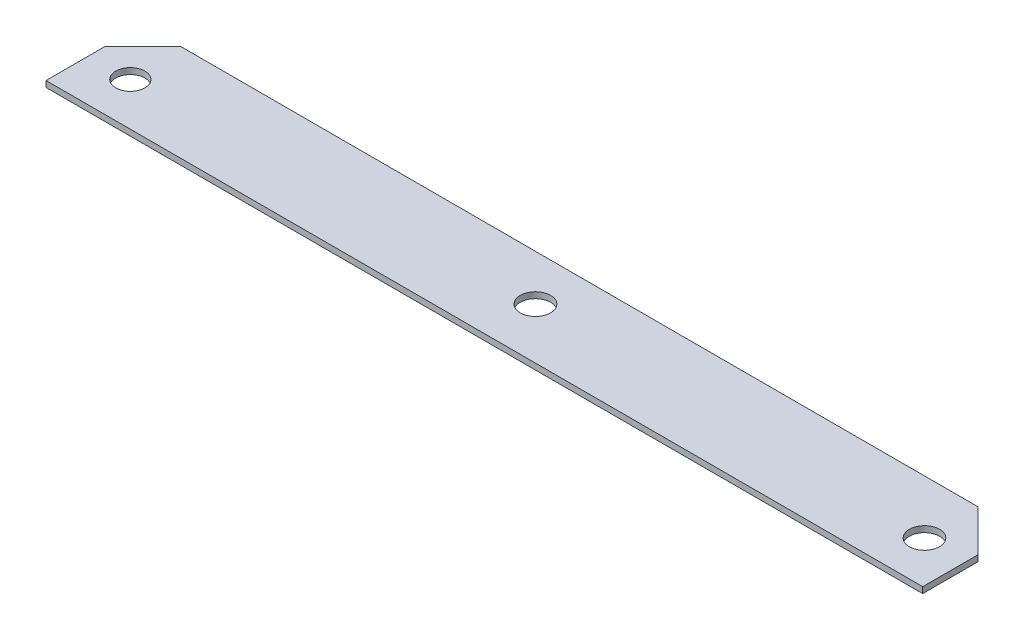
ISO-10303-21;
HEADER;
FILE_DESCRIPTION(('STEP AP214'),'2;1');
FILE_NAME('part.step','',(''),(''),'','','');
FILE_SCHEMA(('AUTOMOTIVE_DESIGN { 1 0 10303 214 1 1 1 1 }'));
ENDSEC;
DATA;
#1=APPLICATION_CONTEXT('core data for automotive mechanical design processes');
#2=APPLICATION_PROTOCOL_DEFINITION('international standard','automotive_design',2000,#1);
#3=PRODUCT_CONTEXT('',#1,'mechanical');
#4=PRODUCT('Part','Part','',(#3));
#5=PRODUCT_RELATED_PRODUCT_CATEGORY('part','',(#4));
#6=PRODUCT_DEFINITION_FORMATION('','',#4);
#7=PRODUCT_DEFINITION_CONTEXT('part definition',#1,'design');
#8=PRODUCT_DEFINITION('design','',#6,#7);
#9=PRODUCT_DEFINITION_SHAPE('','',#8);
#10=(LENGTH_UNIT() NAMED_UNIT(*) SI_UNIT(.MILLI.,.METRE.));
#11=(NAMED_UNIT(*) PLANE_ANGLE_UNIT() SI_UNIT($,.RADIAN.));
#12=(NAMED_UNIT(*) SI_UNIT($,.STERADIAN.) SOLID_ANGLE_UNIT());
#13=UNCERTAINTY_MEASURE_WITH_UNIT(LENGTH_MEASURE(1.E-05),#10,'distance_accuracy_value','');
#14=(GEOMETRIC_REPRESENTATION_CONTEXT(3) GLOBAL_UNCERTAINTY_ASSIGNED_CONTEXT((#13)) GLOBAL_UNIT_ASSIGNED_CONTEXT((#10,
#11,#12)) REPRESENTATION_CONTEXT('',''));
#15=CARTESIAN_POINT('',(0.,0.,0.));
#16=DIRECTION('',(0.,0.,1.));
#17=DIRECTION('',(1.,0.,0.));
#18=AXIS2_PLACEMENT_3D('',#15,#16,#17);
#19=CARTESIAN_POINT('',(122.254977285979,1.5875,-122.254977285981));
#20=DIRECTION('',(0.707106781186539,0.,-0.707106781186556));
#21=DIRECTION('',(-0.707106781186556,0.,-0.707106781186539));
#22=AXIS2_PLACEMENT_3D('',#19,#20,#21);
#23=PLANE('',#22);
#24=DIRECTION('',(0.707106781186556,0.,0.707106781186539));
#25=VECTOR('',#24,1.);
#26=CARTESIAN_POINT('',(122.254977285979,0.,-122.254977285981));
#27=LINE('',#26,#25);
#28=CARTESIAN_POINT('',(219.109954571962,0.,-25.4));
#29=VERTEX_POINT('',#28);
#30=CARTESIAN_POINT('',(230.,0.,-14.5099545719626));
#31=VERTEX_POINT('',#30);
#32=EDGE_CURVE('E130',#29,#31,#27,.T.);
#33=ORIENTED_EDGE('',*,*,#32,.F.);
#34=DIRECTION('',(0.,-1.,0.));
#35=VECTOR('',#34,1.);
#36=CARTESIAN_POINT('',(219.109954571962,1.5875,-25.4));
#37=LINE('',#36,#35);
#38=CARTESIAN_POINT('',(219.109954571962,1.5875,-25.4));
#39=VERTEX_POINT('',#38);
#40=EDGE_CURVE('E11',#39,#29,#37,.T.);
#41=ORIENTED_EDGE('',*,*,#40,.F.);
#42=DIRECTION('',(0.707106781186556,0.,0.707106781186539));
#43=VECTOR('',#42,1.);
#44=CARTESIAN_POINT('',(122.254977285979,1.5875,-122.254977285981));
#45=LINE('',#44,#43);
#46=CARTESIAN_POINT('',(230.,1.5875,-14.5099545719626));
#47=VERTEX_POINT('',#46);
#48=EDGE_CURVE('E194',#39,#47,#45,.T.);
#49=ORIENTED_EDGE('',*,*,#48,.T.);
#50=DIRECTION('',(0.,-1.,0.));
#51=VECTOR('',#50,1.);
#52=CARTESIAN_POINT('',(230.,1.5875,-14.5099545719626));
#53=LINE('',#52,#51);
#54=EDGE_CURVE('E81',#47,#31,#53,.T.);
#55=ORIENTED_EDGE('',*,*,#54,.T.);
#56=EDGE_LOOP('',(#33,#41,#49,#55));
#57=FACE_BOUND('',#56,.T.);
#58=ADVANCED_FACE('F35',(#57),#23,.T.);
#59=CARTESIAN_POINT('',(0.,1.5875,-25.4));
#60=DIRECTION('',(0.,0.,-1.));
#61=DIRECTION('',(-1.,0.,0.));
#62=AXIS2_PLACEMENT_3D('',#59,#60,#61);
#63=PLANE('',#62);
#64=DIRECTION('',(1.,0.,0.));
#65=VECTOR('',#64,1.);
#66=CARTESIAN_POINT('',(0.,0.,-25.4));
#67=LINE('',#66,#65);
#68=CARTESIAN_POINT('',(9.87852439365131,0.,-25.4));
#69=VERTEX_POINT('',#68);
#70=EDGE_CURVE('E132',#69,#29,#67,.T.);
#71=ORIENTED_EDGE('',*,*,#70,.F.);
#72=DIRECTION('',(0.,-1.,0.));
#73=VECTOR('',#72,1.);
#74=CARTESIAN_POINT('',(9.87852439365131,1.5875,-25.4));
#75=LINE('',#74,#73);
#76=CARTESIAN_POINT('',(9.87852439365131,1.5875,-25.4));
#77=VERTEX_POINT('',#76);
#78=EDGE_CURVE('E44',#77,#69,#75,.T.);
#79=ORIENTED_EDGE('',*,*,#78,.F.);
#80=DIRECTION('',(1.,0.,0.));
#81=VECTOR('',#80,1.);
#82=CARTESIAN_POINT('',(0.,1.5875,-25.4));
#83=LINE('',#82,#81);
#84=EDGE_CURVE('E116',#77,#39,#83,.T.);
#85=ORIENTED_EDGE('',*,*,#84,.T.);
#86=ORIENTED_EDGE('',*,*,#40,.T.);
#87=EDGE_LOOP('',(#71,#79,#85,#86));
#88=FACE_BOUND('',#87,.T.);
#89=ADVANCED_FACE('F151',(#88),#63,.T.);
#90=CARTESIAN_POINT('',(-7.76073780317433,1.5875,-7.7607378031743));
#91=DIRECTION('',(-0.707106781186549,0.,-0.707106781186546));
#92=DIRECTION('',(-0.707106781186546,0.,0.707106781186549));
#93=AXIS2_PLACEMENT_3D('',#90,#91,#92);
#94=PLANE('',#93);
#95=DIRECTION('',(0.707106781186546,0.,-0.707106781186549));
#96=VECTOR('',#95,1.);
#97=CARTESIAN_POINT('',(-7.76073780317433,0.,-7.7607378031743));
#98=LINE('',#97,#96);
#99=CARTESIAN_POINT('',(0.,0.,-15.5214756063486));
#100=VERTEX_POINT('',#99);
#101=EDGE_CURVE('E135',#100,#69,#98,.T.);
#102=ORIENTED_EDGE('',*,*,#101,.F.);
#103=DIRECTION('',(0.,-1.,0.));
#104=VECTOR('',#103,1.);
#105=CARTESIAN_POINT('',(0.,1.5875,-15.5214756063486));
#106=LINE('',#105,#104);
#107=CARTESIAN_POINT('',(0.,1.5875,-15.5214756063486));
#108=VERTEX_POINT('',#107);
#109=EDGE_CURVE('E103',#108,#100,#106,.T.);
#110=ORIENTED_EDGE('',*,*,#109,.F.);
#111=DIRECTION('',(0.707106781186546,0.,-0.707106781186549));
#112=VECTOR('',#111,1.);
#113=CARTESIAN_POINT('',(-7.76073780317433,1.5875,-7.7607378031743));
#114=LINE('',#113,#112);
#115=EDGE_CURVE('E114',#108,#77,#114,.T.);
#116=ORIENTED_EDGE('',*,*,#115,.T.);
#117=ORIENTED_EDGE('',*,*,#78,.T.);
#118=EDGE_LOOP('',(#102,#110,#116,#117));
#119=FACE_BOUND('',#118,.T.);
#120=ADVANCED_FACE('F148',(#119),#94,.T.);
#121=CARTESIAN_POINT('',(0.,1.5875,0.));
#122=DIRECTION('',(-1.,0.,0.));
#123=DIRECTION('',(0.,0.,1.));
#124=AXIS2_PLACEMENT_3D('',#121,#122,#123);
#125=PLANE('',#124);
#126=DIRECTION('',(0.,0.,-1.));
#127=VECTOR('',#126,1.);
#128=CARTESIAN_POINT('',(0.,0.,0.));
#129=LINE('',#128,#127);
#130=CARTESIAN_POINT('',(0.,0.,0.));
#131=VERTEX_POINT('',#130);
#132=EDGE_CURVE('E100',#131,#100,#129,.T.);
#133=ORIENTED_EDGE('',*,*,#132,.F.);
#134=DIRECTION('',(0.,-1.,0.));
#135=VECTOR('',#134,1.);
#136=CARTESIAN_POINT('',(0.,1.5875,0.));
#137=LINE('',#136,#135);
#138=CARTESIAN_POINT('',(0.,1.5875,0.));
#139=VERTEX_POINT('',#138);
#140=EDGE_CURVE('E94',#139,#131,#137,.T.);
#141=ORIENTED_EDGE('',*,*,#140,.F.);
#142=DIRECTION('',(0.,0.,-1.));
#143=VECTOR('',#142,1.);
#144=CARTESIAN_POINT('',(0.,1.5875,0.));
#145=LINE('',#144,#143);
#146=EDGE_CURVE('E98',#139,#108,#145,.T.);
#147=ORIENTED_EDGE('',*,*,#146,.T.);
#148=ORIENTED_EDGE('',*,*,#109,.T.);
#149=EDGE_LOOP('',(#133,#141,#147,#148));
#150=FACE_BOUND('',#149,.T.);
#151=ADVANCED_FACE('F96',(#150),#125,.T.);
#152=CARTESIAN_POINT('',(0.,1.5875,0.));
#153=DIRECTION('',(0.,0.,-1.));
#154=DIRECTION('',(-1.,0.,0.));
#155=AXIS2_PLACEMENT_3D('',#152,#153,#154);
#156=PLANE('',#155);
#157=DIRECTION('',(1.,0.,0.));
#158=VECTOR('',#157,1.);
#159=CARTESIAN_POINT('',(0.,0.,0.));
#160=LINE('',#159,#158);
#161=CARTESIAN_POINT('',(230.,0.,0.));
#162=VERTEX_POINT('',#161);
#163=EDGE_CURVE('E139',#131,#162,#160,.T.);
#164=ORIENTED_EDGE('',*,*,#163,.T.);
#165=DIRECTION('',(0.,-1.,0.));
#166=VECTOR('',#165,1.);
#167=CARTESIAN_POINT('',(230.,1.5875,0.));
#168=LINE('',#167,#166);
#169=CARTESIAN_POINT('',(230.,1.5875,0.));
#170=VERTEX_POINT('',#169);
#171=EDGE_CURVE('E104',#170,#162,#168,.T.);
#172=ORIENTED_EDGE('',*,*,#171,.F.);
#173=DIRECTION('',(1.,0.,0.));
#174=VECTOR('',#173,1.);
#175=CARTESIAN_POINT('',(0.,1.5875,0.));
#176=LINE('',#175,#174);
#177=EDGE_CURVE('E107',#139,#170,#176,.T.);
#178=ORIENTED_EDGE('',*,*,#177,.F.);
#179=ORIENTED_EDGE('',*,*,#140,.T.);
#180=EDGE_LOOP('',(#164,#172,#178,#179));
#181=FACE_BOUND('',#180,.T.);
#182=ADVANCED_FACE('F108',(#181),#156,.F.);
#183=CARTESIAN_POINT('',(10.827296289935,1.5875,-11.2956102799355));
#184=DIRECTION('',(0.,-1.,0.));
#185=DIRECTION('',(0.,0.,-1.));
#186=AXIS2_PLACEMENT_3D('',#183,#184,#185);
#187=CYLINDRICAL_SURFACE('',#186,3.82498757359968);
#188=CARTESIAN_POINT('',(10.827296289935,1.5875,-11.2956102799355));
#189=DIRECTION('',(0.,1.,0.));
#190=DIRECTION('',(0.,0.,1.));
#191=AXIS2_PLACEMENT_3D('',#188,#189,#190);
#192=CIRCLE('',#191,3.82498757359968);
#193=CARTESIAN_POINT('',(10.827296289935,1.5875,-7.47062270633585));
#194=VERTEX_POINT('',#193);
#195=EDGE_CURVE('E191',#194,#194,#192,.T.);
#196=ORIENTED_EDGE('',*,*,#195,.T.);
#197=EDGE_LOOP('',(#196));
#198=FACE_BOUND('',#197,.T.);
#199=CARTESIAN_POINT('',(10.827296289935,0.,-11.2956102799355));
#200=DIRECTION('',(0.,1.,0.));
#201=DIRECTION('',(0.,0.,1.));
#202=AXIS2_PLACEMENT_3D('',#199,#200,#201);
#203=CIRCLE('',#202,3.82498757359968);
#204=CARTESIAN_POINT('',(10.827296289935,0.,-7.47062270633585));
#205=VERTEX_POINT('',#204);
#206=EDGE_CURVE('E127',#205,#205,#203,.T.);
#207=ORIENTED_EDGE('',*,*,#206,.F.);
#208=EDGE_LOOP('',(#207));
#209=FACE_BOUND('',#208,.T.);
#210=ADVANCED_FACE('F172',(#198,#209),#187,.F.);
#211=CARTESIAN_POINT('',(115.,1.5875,-13.4));
#212=DIRECTION('',(0.,-1.,0.));
#213=DIRECTION('',(0.,0.,-1.));
#214=AXIS2_PLACEMENT_3D('',#211,#212,#213);
#215=CYLINDRICAL_SURFACE('',#214,3.97949019683394);
#216=CARTESIAN_POINT('',(115.,1.5875,-13.4));
#217=DIRECTION('',(0.,1.,0.));
#218=DIRECTION('',(0.,0.,1.));
#219=AXIS2_PLACEMENT_3D('',#216,#217,#218);
#220=CIRCLE('',#219,3.97949019683394);
#221=CARTESIAN_POINT('',(115.,1.5875,-9.42050980316606));
#222=VERTEX_POINT('',#221);
#223=EDGE_CURVE('E185',#222,#222,#220,.T.);
#224=ORIENTED_EDGE('',*,*,#223,.T.);
#225=EDGE_LOOP('',(#224));
#226=FACE_BOUND('',#225,.T.);
#227=CARTESIAN_POINT('',(115.,0.,-13.4));
#228=DIRECTION('',(0.,1.,0.));
#229=DIRECTION('',(0.,0.,1.));
#230=AXIS2_PLACEMENT_3D('',#227,#228,#229);
#231=CIRCLE('',#230,3.97949019683394);
#232=CARTESIAN_POINT('',(115.,0.,-9.42050980316606));
#233=VERTEX_POINT('',#232);
#234=EDGE_CURVE('E124',#233,#233,#231,.T.);
#235=ORIENTED_EDGE('',*,*,#234,.F.);
#236=EDGE_LOOP('',(#235));
#237=FACE_BOUND('',#236,.T.);
#238=ADVANCED_FACE('F174',(#226,#237),#215,.F.);
#239=CARTESIAN_POINT('',(219.172703710059,1.5875,-11.2956102799345));
#240=DIRECTION('',(0.,-1.,0.));
#241=DIRECTION('',(0.,0.,-1.));
#242=AXIS2_PLACEMENT_3D('',#239,#240,#241);
#243=CYLINDRICAL_SURFACE('',#242,3.96006972292955);
#244=CARTESIAN_POINT('',(219.172703710059,1.5875,-11.2956102799345));
#245=DIRECTION('',(0.,1.,0.));
#246=DIRECTION('',(0.,0.,1.));
#247=AXIS2_PLACEMENT_3D('',#244,#245,#246);
#248=CIRCLE('',#247,3.96006972292955);
#249=CARTESIAN_POINT('',(219.172703710059,1.5875,-7.33554055700491));
#250=VERTEX_POINT('',#249);
#251=EDGE_CURVE('E142',#250,#250,#248,.T.);
#252=ORIENTED_EDGE('',*,*,#251,.T.);
#253=EDGE_LOOP('',(#252));
#254=FACE_BOUND('',#253,.T.);
#255=CARTESIAN_POINT('',(219.172703710059,0.,-11.2956102799345));
#256=DIRECTION('',(0.,1.,0.));
#257=DIRECTION('',(0.,0.,1.));
#258=AXIS2_PLACEMENT_3D('',#255,#256,#257);
#259=CIRCLE('',#258,3.96006972292955);
#260=CARTESIAN_POINT('',(219.172703710059,0.,-7.33554055700491));
#261=VERTEX_POINT('',#260);
#262=EDGE_CURVE('E121',#261,#261,#259,.T.);
#263=ORIENTED_EDGE('',*,*,#262,.F.);
#264=EDGE_LOOP('',(#263));
#265=FACE_BOUND('',#264,.T.);
#266=ADVANCED_FACE('F37',(#254,#265),#243,.F.);
#267=CARTESIAN_POINT('',(230.,1.5875,0.));
#268=DIRECTION('',(-1.,0.,0.));
#269=DIRECTION('',(0.,0.,1.));
#270=AXIS2_PLACEMENT_3D('',#267,#268,#269);
#271=PLANE('',#270);
#272=DIRECTION('',(0.,0.,-1.));
#273=VECTOR('',#272,1.);
#274=CARTESIAN_POINT('',(230.,0.,0.));
#275=LINE('',#274,#273);
#276=EDGE_CURVE('E74',#162,#31,#275,.T.);
#277=ORIENTED_EDGE('',*,*,#276,.T.);
#278=ORIENTED_EDGE('',*,*,#54,.F.);
#279=DIRECTION('',(0.,0.,-1.));
#280=VECTOR('',#279,1.);
#281=CARTESIAN_POINT('',(230.,1.5875,0.));
#282=LINE('',#281,#280);
#283=EDGE_CURVE('E52',#170,#47,#282,.T.);
#284=ORIENTED_EDGE('',*,*,#283,.F.);
#285=ORIENTED_EDGE('',*,*,#171,.T.);
#286=EDGE_LOOP('',(#277,#278,#284,#285));
#287=FACE_BOUND('',#286,.T.);
#288=ADVANCED_FACE('F159',(#287),#271,.F.);
#289=CARTESIAN_POINT('',(0.,1.5875,0.));
#290=DIRECTION('',(0.,1.,0.));
#291=DIRECTION('',(0.,0.,1.));
#292=AXIS2_PLACEMENT_3D('',#289,#290,#291);
#293=PLANE('',#292);
#294=ORIENTED_EDGE('',*,*,#251,.F.);
#295=EDGE_LOOP('',(#294));
#296=FACE_BOUND('',#295,.T.);
#297=ORIENTED_EDGE('',*,*,#223,.F.);
#298=EDGE_LOOP('',(#297));
#299=FACE_BOUND('',#298,.T.);
#300=ORIENTED_EDGE('',*,*,#195,.F.);
#301=EDGE_LOOP('',(#300));
#302=FACE_BOUND('',#301,.T.);
#303=ORIENTED_EDGE('',*,*,#48,.F.);
#304=ORIENTED_EDGE('',*,*,#84,.F.);
#305=ORIENTED_EDGE('',*,*,#115,.F.);
#306=ORIENTED_EDGE('',*,*,#146,.F.);
#307=ORIENTED_EDGE('',*,*,#177,.T.);
#308=ORIENTED_EDGE('',*,*,#283,.T.);
#309=EDGE_LOOP('',(#303,#304,#305,#306,#307,#308));
#310=FACE_BOUND('',#309,.T.);
#311=ADVANCED_FACE('F111',(#296,#299,#302,#310),#293,.T.);
#312=CARTESIAN_POINT('',(0.,0.,0.));
#313=DIRECTION('',(0.,1.,0.));
#314=DIRECTION('',(0.,0.,1.));
#315=AXIS2_PLACEMENT_3D('',#312,#313,#314);
#316=PLANE('',#315);
#317=ORIENTED_EDGE('',*,*,#262,.T.);
#318=EDGE_LOOP('',(#317));
#319=FACE_BOUND('',#318,.T.);
#320=ORIENTED_EDGE('',*,*,#234,.T.);
#321=EDGE_LOOP('',(#320));
#322=FACE_BOUND('',#321,.T.);
#323=ORIENTED_EDGE('',*,*,#206,.T.);
#324=EDGE_LOOP('',(#323));
#325=FACE_BOUND('',#324,.T.);
#326=ORIENTED_EDGE('',*,*,#32,.T.);
#327=ORIENTED_EDGE('',*,*,#276,.F.);
#328=ORIENTED_EDGE('',*,*,#163,.F.);
#329=ORIENTED_EDGE('',*,*,#132,.T.);
#330=ORIENTED_EDGE('',*,*,#101,.T.);
#331=ORIENTED_EDGE('',*,*,#70,.T.);
#332=EDGE_LOOP('',(#326,#327,#328,#329,#330,#331));
#333=FACE_BOUND('',#332,.T.);
#334=ADVANCED_FACE('F152',(#319,#322,#325,#333),#316,.F.);
#335=CLOSED_SHELL('',(#58,#89,#120,#151,#182,#210,#238,#266,#288,#311,#334));
#336=MANIFOLD_SOLID_BREP('B2',#335);
#337=ADVANCED_BREP_SHAPE_REPRESENTATION('',(#18,#336),#14);
#338=SHAPE_DEFINITION_REPRESENTATION(#9,#337);
ENDSEC;
END-ISO-10303-21;
